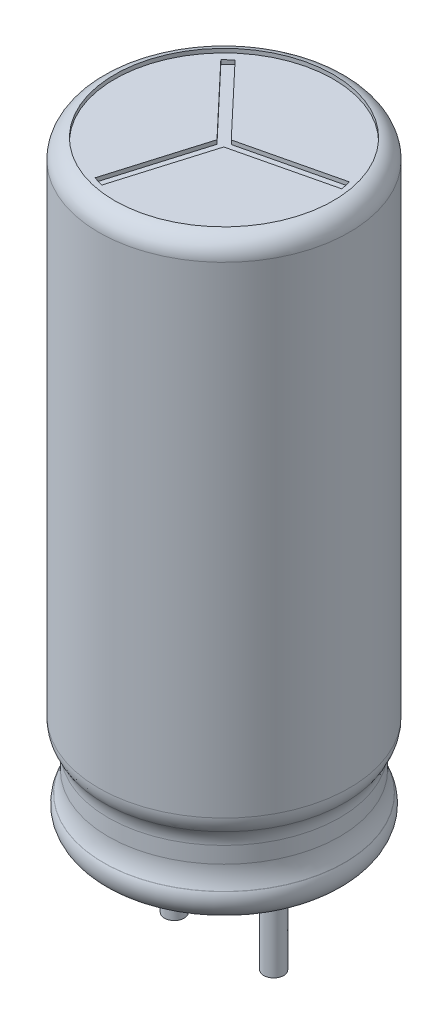
ISO-10303-21;
HEADER;
FILE_DESCRIPTION(('STEP AP214'),'2;1');
FILE_NAME('part.step','',(''),(''),'','','');
FILE_SCHEMA(('AUTOMOTIVE_DESIGN { 1 0 10303 214 1 1 1 1 }'));
ENDSEC;
DATA;
#1=APPLICATION_CONTEXT('core data for automotive mechanical design processes');
#2=APPLICATION_PROTOCOL_DEFINITION('international standard','automotive_design',2000,#1);
#3=PRODUCT_CONTEXT('',#1,'mechanical');
#4=PRODUCT('Part','Part','',(#3));
#5=PRODUCT_RELATED_PRODUCT_CATEGORY('part','',(#4));
#6=PRODUCT_DEFINITION_FORMATION('','',#4);
#7=PRODUCT_DEFINITION_CONTEXT('part definition',#1,'design');
#8=PRODUCT_DEFINITION('design','',#6,#7);
#9=PRODUCT_DEFINITION_SHAPE('','',#8);
#10=(LENGTH_UNIT() NAMED_UNIT(*) SI_UNIT(.MILLI.,.METRE.));
#11=(NAMED_UNIT(*) PLANE_ANGLE_UNIT() SI_UNIT($,.RADIAN.));
#12=(NAMED_UNIT(*) SI_UNIT($,.STERADIAN.) SOLID_ANGLE_UNIT());
#13=UNCERTAINTY_MEASURE_WITH_UNIT(LENGTH_MEASURE(1.E-05),#10,'distance_accuracy_value','');
#14=(GEOMETRIC_REPRESENTATION_CONTEXT(3) GLOBAL_UNCERTAINTY_ASSIGNED_CONTEXT((#13)) GLOBAL_UNIT_ASSIGNED_CONTEXT((#10,
#11,#12)) REPRESENTATION_CONTEXT('',''));
#15=CARTESIAN_POINT('',(0.,0.,0.));
#16=DIRECTION('',(0.,0.,1.));
#17=DIRECTION('',(1.,0.,0.));
#18=AXIS2_PLACEMENT_3D('',#15,#16,#17);
#19=CARTESIAN_POINT('',(0.,15.,0.));
#20=DIRECTION('',(0.,-1.,0.));
#21=DIRECTION('',(0.,0.,-1.));
#22=AXIS2_PLACEMENT_3D('',#19,#20,#21);
#23=CYLINDRICAL_SURFACE('',#22,3.15);
#24=CARTESIAN_POINT('',(0.,14.5101020514434,0.));
#25=DIRECTION('',(0.,1.,0.));
#26=DIRECTION('',(0.,0.,1.));
#27=AXIS2_PLACEMENT_3D('',#24,#25,#26);
#28=CIRCLE('',#27,3.15);
#29=CARTESIAN_POINT('',(0.,14.5101020514434,3.15));
#30=VERTEX_POINT('',#29);
#31=EDGE_CURVE('E231',#30,#30,#28,.F.);
#32=ORIENTED_EDGE('',*,*,#31,.T.);
#33=EDGE_LOOP('',(#32));
#34=FACE_BOUND('',#33,.T.);
#35=CARTESIAN_POINT('',(0.,2.40756880196224,0.));
#36=DIRECTION('',(0.,-1.,0.));
#37=DIRECTION('',(0.,0.,-1.));
#38=AXIS2_PLACEMENT_3D('',#35,#36,#37);
#39=CIRCLE('',#38,3.15);
#40=CARTESIAN_POINT('',(0.,2.40756880196224,-3.15));
#41=VERTEX_POINT('',#40);
#42=EDGE_CURVE('E208',#41,#41,#39,.T.);
#43=ORIENTED_EDGE('',*,*,#42,.F.);
#44=EDGE_LOOP('',(#43));
#45=FACE_BOUND('',#44,.T.);
#46=ADVANCED_FACE('F38',(#34,#45),#23,.T.);
#47=CARTESIAN_POINT('',(0.,0.,0.));
#48=DIRECTION('',(0.,-1.,0.));
#49=DIRECTION('',(0.,0.,-1.));
#50=AXIS2_PLACEMENT_3D('',#47,#48,#49);
#51=PLANE('',#50);
#52=CARTESIAN_POINT('',(-1.25,0.,0.));
#53=DIRECTION('',(0.,-1.,0.));
#54=DIRECTION('',(0.,0.,-1.));
#55=AXIS2_PLACEMENT_3D('',#52,#53,#54);
#56=CIRCLE('',#55,0.25);
#57=CARTESIAN_POINT('',(-1.25,0.,-0.25));
#58=VERTEX_POINT('',#57);
#59=EDGE_CURVE('E11',#58,#58,#56,.T.);
#60=ORIENTED_EDGE('',*,*,#59,.F.);
#61=EDGE_LOOP('',(#60));
#62=FACE_BOUND('',#61,.T.);
#63=CARTESIAN_POINT('',(1.25,0.,0.));
#64=DIRECTION('',(0.,-1.,0.));
#65=DIRECTION('',(0.,0.,-1.));
#66=AXIS2_PLACEMENT_3D('',#63,#64,#65);
#67=CIRCLE('',#66,0.25);
#68=CARTESIAN_POINT('',(1.25,0.,-0.25));
#69=VERTEX_POINT('',#68);
#70=EDGE_CURVE('E47',#69,#69,#67,.T.);
#71=ORIENTED_EDGE('',*,*,#70,.F.);
#72=EDGE_LOOP('',(#71));
#73=FACE_BOUND('',#72,.T.);
#74=CARTESIAN_POINT('',(0.,0.,0.));
#75=DIRECTION('',(0.,-1.,0.));
#76=DIRECTION('',(0.,0.,-1.));
#77=AXIS2_PLACEMENT_3D('',#74,#75,#76);
#78=CIRCLE('',#77,2.583882438621);
#79=CARTESIAN_POINT('',(0.,0.,-2.583882438621));
#80=VERTEX_POINT('',#79);
#81=EDGE_CURVE('E235',#80,#80,#78,.T.);
#82=ORIENTED_EDGE('',*,*,#81,.T.);
#83=EDGE_LOOP('',(#82));
#84=FACE_BOUND('',#83,.T.);
#85=ADVANCED_FACE('F248',(#62,#73,#84),#51,.T.);
#86=CARTESIAN_POINT('',(0.,0.362697062752752,0.));
#87=DIRECTION('',(0.,-1.,0.));
#88=DIRECTION('',(0.,0.,-1.));
#89=AXIS2_PLACEMENT_3D('',#86,#87,#88);
#90=TOROIDAL_SURFACE('',#89,2.30519901542106,0.810671123445938);
#91=CARTESIAN_POINT('',(0.,0.720977952061164,0.));
#92=DIRECTION('',(0.,-1.,0.));
#93=DIRECTION('',(0.,0.,-1.));
#94=AXIS2_PLACEMENT_3D('',#91,#92,#93);
#95=CIRCLE('',#94,3.03240082698747);
#96=CARTESIAN_POINT('',(0.,0.720977952061164,-3.03240082698747));
#97=VERTEX_POINT('',#96);
#98=EDGE_CURVE('E239',#97,#97,#95,.F.);
#99=ORIENTED_EDGE('',*,*,#98,.T.);
#100=EDGE_LOOP('',(#99));
#101=FACE_BOUND('',#100,.T.);
#102=CARTESIAN_POINT('',(0.,0.725394125505504,0.));
#103=DIRECTION('',(0.,-1.,0.));
#104=DIRECTION('',(0.,0.,-1.));
#105=AXIS2_PLACEMENT_3D('',#102,#103,#104);
#106=CIRCLE('',#105,3.03020833333333);
#107=CARTESIAN_POINT('',(0.,0.725394125505504,-3.03020833333333));
#108=VERTEX_POINT('',#107);
#109=EDGE_CURVE('E227',#108,#108,#106,.T.);
#110=ORIENTED_EDGE('',*,*,#109,.T.);
#111=EDGE_LOOP('',(#110));
#112=FACE_BOUND('',#111,.T.);
#113=ADVANCED_FACE('F251',(#101,#112),#90,.T.);
#114=CARTESIAN_POINT('',(0.,1.23259900370742,0.));
#115=DIRECTION('',(0.,-1.,0.));
#116=DIRECTION('',(0.,0.,-1.));
#117=AXIS2_PLACEMENT_3D('',#114,#115,#116);
#118=TOROIDAL_SURFACE('',#117,4.04407996492587,1.1336632982592);
#119=CARTESIAN_POINT('',(0.,1.23259900370742,0.));
#120=DIRECTION('',(0.,-1.,0.));
#121=DIRECTION('',(0.,0.,-1.));
#122=AXIS2_PLACEMENT_3D('',#119,#120,#121);
#123=CIRCLE('',#122,2.91041666666667);
#124=CARTESIAN_POINT('',(0.,1.23259900370742,-2.91041666666667));
#125=VERTEX_POINT('',#124);
#126=EDGE_CURVE('E223',#125,#125,#123,.T.);
#127=ORIENTED_EDGE('',*,*,#126,.T.);
#128=EDGE_LOOP('',(#127));
#129=FACE_BOUND('',#128,.T.);
#130=ORIENTED_EDGE('',*,*,#109,.F.);
#131=EDGE_LOOP('',(#130));
#132=FACE_BOUND('',#131,.T.);
#133=ADVANCED_FACE('F277',(#129,#132),#118,.F.);
#134=CARTESIAN_POINT('',(0.,15.,0.));
#135=DIRECTION('',(0.,-1.,0.));
#136=DIRECTION('',(0.,0.,-1.));
#137=AXIS2_PLACEMENT_3D('',#134,#135,#136);
#138=CYLINDRICAL_SURFACE('',#137,2.91041666666667);
#139=CARTESIAN_POINT('',(0.,1.64240099629258,0.));
#140=DIRECTION('',(0.,-1.,0.));
#141=DIRECTION('',(0.,0.,-1.));
#142=AXIS2_PLACEMENT_3D('',#139,#140,#141);
#143=CIRCLE('',#142,2.91041666666667);
#144=CARTESIAN_POINT('',(0.,1.64240099629258,-2.91041666666667));
#145=VERTEX_POINT('',#144);
#146=EDGE_CURVE('E219',#145,#145,#143,.T.);
#147=ORIENTED_EDGE('',*,*,#146,.T.);
#148=EDGE_LOOP('',(#147));
#149=FACE_BOUND('',#148,.T.);
#150=ORIENTED_EDGE('',*,*,#126,.F.);
#151=EDGE_LOOP('',(#150));
#152=FACE_BOUND('',#151,.T.);
#153=ADVANCED_FACE('F281',(#149,#152),#138,.T.);
#154=CARTESIAN_POINT('',(0.,1.64240099629258,0.));
#155=DIRECTION('',(0.,-1.,0.));
#156=DIRECTION('',(0.,0.,-1.));
#157=AXIS2_PLACEMENT_3D('',#154,#155,#156);
#158=TOROIDAL_SURFACE('',#157,3.58125,0.670833333333335);
#159=CARTESIAN_POINT('',(0.,2.02498489912741,0.));
#160=DIRECTION('',(0.,-1.,0.));
#161=DIRECTION('',(0.,0.,-1.));
#162=AXIS2_PLACEMENT_3D('',#159,#160,#161);
#163=CIRCLE('',#162,3.03020833333333);
#164=CARTESIAN_POINT('',(0.,2.02498489912741,-3.03020833333333));
#165=VERTEX_POINT('',#164);
#166=EDGE_CURVE('E215',#165,#165,#163,.T.);
#167=ORIENTED_EDGE('',*,*,#166,.T.);
#168=EDGE_LOOP('',(#167));
#169=FACE_BOUND('',#168,.T.);
#170=ORIENTED_EDGE('',*,*,#146,.F.);
#171=EDGE_LOOP('',(#170));
#172=FACE_BOUND('',#171,.T.);
#173=ADVANCED_FACE('F285',(#169,#172),#158,.F.);
#174=CARTESIAN_POINT('',(0.,2.40756880196224,0.));
#175=DIRECTION('',(0.,-1.,0.));
#176=DIRECTION('',(0.,0.,-1.));
#177=AXIS2_PLACEMENT_3D('',#174,#175,#176);
#178=TOROIDAL_SURFACE('',#177,2.47916666666667,0.670833333333332);
#179=ORIENTED_EDGE('',*,*,#42,.T.);
#180=EDGE_LOOP('',(#179));
#181=FACE_BOUND('',#180,.T.);
#182=ORIENTED_EDGE('',*,*,#166,.F.);
#183=EDGE_LOOP('',(#182));
#184=FACE_BOUND('',#183,.T.);
#185=ADVANCED_FACE('F289',(#181,#184),#178,.T.);
#186=CARTESIAN_POINT('',(0.,14.9,0.));
#187=DIRECTION('',(0.,1.,0.));
#188=DIRECTION('',(0.,0.,1.));
#189=AXIS2_PLACEMENT_3D('',#186,#187,#188);
#190=CYLINDRICAL_SURFACE('',#189,2.75);
#191=CARTESIAN_POINT('',(0.,14.9,0.));
#192=DIRECTION('',(0.,1.,0.));
#193=DIRECTION('',(0.,0.,-1.));
#194=AXIS2_PLACEMENT_3D('',#191,#192,#193);
#195=CIRCLE('',#194,2.75);
#196=CARTESIAN_POINT('',(0.,14.9,-2.75));
#197=VERTEX_POINT('',#196);
#198=EDGE_CURVE('E204',#197,#197,#195,.T.);
#199=ORIENTED_EDGE('',*,*,#198,.F.);
#200=EDGE_LOOP('',(#199));
#201=FACE_BOUND('',#200,.T.);
#202=CARTESIAN_POINT('',(0.,15.,0.));
#203=DIRECTION('',(0.,1.,0.));
#204=DIRECTION('',(0.,0.,-1.));
#205=AXIS2_PLACEMENT_3D('',#202,#203,#204);
#206=CIRCLE('',#205,2.75);
#207=CARTESIAN_POINT('',(0.,15.,-2.75));
#208=VERTEX_POINT('',#207);
#209=EDGE_CURVE('E185',#208,#208,#206,.T.);
#210=ORIENTED_EDGE('',*,*,#209,.T.);
#211=EDGE_LOOP('',(#210));
#212=FACE_BOUND('',#211,.T.);
#213=ADVANCED_FACE('F293',(#201,#212),#190,.F.);
#214=CARTESIAN_POINT('',(0.,14.9,0.));
#215=DIRECTION('',(0.,-1.,0.));
#216=DIRECTION('',(0.,0.,-1.));
#217=AXIS2_PLACEMENT_3D('',#214,#215,#216);
#218=PLANE('',#217);
#219=DIRECTION('',(-0.72638071356326,0.,0.687292557040545));
#220=VECTOR('',#219,1.);
#221=CARTESIAN_POINT('',(-1.65347274426045,14.9,-1.93229316719483));
#222=LINE('',#221,#220);
#223=CARTESIAN_POINT('',(-1.65347274426045,14.9,-1.93229316719483));
#224=VERTEX_POINT('',#223);
#225=CARTESIAN_POINT('',(-1.83797344550552,14.9,-1.75772085770653));
#226=VERTEX_POINT('',#225);
#227=EDGE_CURVE('E154',#224,#226,#222,.T.);
#228=ORIENTED_EDGE('',*,*,#227,.F.);
#229=DIRECTION('',(-0.687292557040545,0.,-0.726380713563259));
#230=VECTOR('',#229,1.);
#231=CARTESIAN_POINT('',(0.0418556656844723,14.9,-0.140546919508906));
#232=LINE('',#231,#230);
#233=CARTESIAN_POINT('',(0.0418556656844723,14.9,-0.140546919508906));
#234=VERTEX_POINT('',#233);
#235=EDGE_CURVE('E54',#234,#224,#232,.T.);
#236=ORIENTED_EDGE('',*,*,#235,.F.);
#237=DIRECTION('',(-0.972710429285124,0.,0.232022457447443));
#238=VECTOR('',#237,1.);
#239=CARTESIAN_POINT('',(2.44121763828839,14.9,-0.712871266435717));
#240=LINE('',#239,#238);
#241=CARTESIAN_POINT('',(2.44121763828839,14.9,-0.712871266435717));
#242=VERTEX_POINT('',#241);
#243=EDGE_CURVE('E179',#242,#234,#240,.T.);
#244=ORIENTED_EDGE('',*,*,#243,.F.);
#245=DIRECTION('',(-0.232022457447444,0.,-0.972710429285123));
#246=VECTOR('',#245,1.);
#247=CARTESIAN_POINT('',(2.50015134248004,14.9,-0.465802817397295));
#248=LINE('',#247,#246);
#249=CARTESIAN_POINT('',(2.50015134248004,14.9,-0.465802817397295));
#250=VERTEX_POINT('',#249);
#251=EDGE_CURVE('E176',#250,#242,#248,.T.);
#252=ORIENTED_EDGE('',*,*,#251,.F.);
#253=DIRECTION('',(0.972710429285124,0.,-0.232022457447443));
#254=VECTOR('',#253,1.);
#255=CARTESIAN_POINT('',(0.100789369876124,14.9,0.106521529529515));
#256=LINE('',#255,#254);
#257=CARTESIAN_POINT('',(0.100789369876124,14.9,0.106521529529515));
#258=VERTEX_POINT('',#257);
#259=EDGE_CURVE('E120',#258,#250,#256,.T.);
#260=ORIENTED_EDGE('',*,*,#259,.F.);
#261=DIRECTION('',(0.285417872244573,0.,-0.958403171010708));
#262=VECTOR('',#261,1.);
#263=CARTESIAN_POINT('',(-0.603244192782856,14.9,2.47059212414226));
#264=LINE('',#263,#262);
#265=CARTESIAN_POINT('',(-0.603244192782856,14.9,2.47059212414226));
#266=VERTEX_POINT('',#265);
#267=EDGE_CURVE('E170',#266,#258,#264,.T.);
#268=ORIENTED_EDGE('',*,*,#267,.F.);
#269=DIRECTION('',(0.958403171010708,0.,0.285417872244573));
#270=VECTOR('',#269,1.);
#271=CARTESIAN_POINT('',(-0.846678598219576,14.9,2.39809598459214));
#272=LINE('',#271,#270);
#273=CARTESIAN_POINT('',(-0.846678598219576,14.9,2.39809598459214));
#274=VERTEX_POINT('',#273);
#275=EDGE_CURVE('E166',#274,#266,#272,.T.);
#276=ORIENTED_EDGE('',*,*,#275,.F.);
#277=DIRECTION('',(-0.285417872244573,0.,0.958403171010708));
#278=VECTOR('',#277,1.);
#279=CARTESIAN_POINT('',(-0.142645035560596,14.9,0.0340253899793922));
#280=LINE('',#279,#278);
#281=CARTESIAN_POINT('',(-0.142645035560596,14.9,0.0340253899793922));
#282=VERTEX_POINT('',#281);
#283=EDGE_CURVE('E162',#282,#274,#280,.T.);
#284=ORIENTED_EDGE('',*,*,#283,.F.);
#285=DIRECTION('',(0.687292557040545,0.,0.726380713563259));
#286=VECTOR('',#285,1.);
#287=CARTESIAN_POINT('',(-1.83797344550552,14.9,-1.75772085770653));
#288=LINE('',#287,#286);
#289=EDGE_CURVE('E158',#226,#282,#288,.T.);
#290=ORIENTED_EDGE('',*,*,#289,.F.);
#291=EDGE_LOOP('',(#228,#236,#244,#252,#260,#268,#276,#284,#290));
#292=FACE_BOUND('',#291,.T.);
#293=ORIENTED_EDGE('',*,*,#198,.T.);
#294=EDGE_LOOP('',(#293));
#295=FACE_BOUND('',#294,.T.);
#296=ADVANCED_FACE('F297',(#292,#295),#218,.F.);
#297=CARTESIAN_POINT('',(0.0418556656844723,14.8,-0.140546919508906));
#298=DIRECTION('',(0.726380713563259,0.,-0.687292557040545));
#299=DIRECTION('',(-0.687292557040545,0.,-0.726380713563259));
#300=AXIS2_PLACEMENT_3D('',#297,#298,#299);
#301=PLANE('',#300);
#302=ORIENTED_EDGE('',*,*,#235,.T.);
#303=DIRECTION('',(0.,1.,0.));
#304=VECTOR('',#303,1.);
#305=CARTESIAN_POINT('',(-1.65347274426045,14.8,-1.93229316719483));
#306=LINE('',#305,#304);
#307=CARTESIAN_POINT('',(-1.65347274426045,14.8,-1.93229316719483));
#308=VERTEX_POINT('',#307);
#309=EDGE_CURVE('E93',#308,#224,#306,.T.);
#310=ORIENTED_EDGE('',*,*,#309,.F.);
#311=DIRECTION('',(-0.687292557040545,0.,-0.726380713563259));
#312=VECTOR('',#311,1.);
#313=CARTESIAN_POINT('',(0.0418556656844723,14.8,-0.140546919508906));
#314=LINE('',#313,#312);
#315=CARTESIAN_POINT('',(0.0418556656844723,14.8,-0.140546919508906));
#316=VERTEX_POINT('',#315);
#317=EDGE_CURVE('E182',#316,#308,#314,.T.);
#318=ORIENTED_EDGE('',*,*,#317,.F.);
#319=DIRECTION('',(0.,1.,0.));
#320=VECTOR('',#319,1.);
#321=CARTESIAN_POINT('',(0.0418556656844723,14.8,-0.140546919508906));
#322=LINE('',#321,#320);
#323=EDGE_CURVE('E62',#316,#234,#322,.T.);
#324=ORIENTED_EDGE('',*,*,#323,.T.);
#325=EDGE_LOOP('',(#302,#310,#318,#324));
#326=FACE_BOUND('',#325,.T.);
#327=ADVANCED_FACE('F301',(#326),#301,.F.);
#328=CARTESIAN_POINT('',(2.44121763828839,14.8,-0.712871266435717));
#329=DIRECTION('',(-0.232022457447443,0.,-0.972710429285124));
#330=DIRECTION('',(-0.972710429285124,0.,0.232022457447443));
#331=AXIS2_PLACEMENT_3D('',#328,#329,#330);
#332=PLANE('',#331);
#333=ORIENTED_EDGE('',*,*,#243,.T.);
#334=ORIENTED_EDGE('',*,*,#323,.F.);
#335=DIRECTION('',(-0.972710429285124,0.,0.232022457447443));
#336=VECTOR('',#335,1.);
#337=CARTESIAN_POINT('',(2.44121763828839,14.8,-0.712871266435717));
#338=LINE('',#337,#336);
#339=CARTESIAN_POINT('',(2.44121763828839,14.8,-0.712871266435717));
#340=VERTEX_POINT('',#339);
#341=EDGE_CURVE('E134',#340,#316,#338,.T.);
#342=ORIENTED_EDGE('',*,*,#341,.F.);
#343=DIRECTION('',(0.,1.,0.));
#344=VECTOR('',#343,1.);
#345=CARTESIAN_POINT('',(2.44121763828839,14.8,-0.712871266435717));
#346=LINE('',#345,#344);
#347=EDGE_CURVE('E125',#340,#242,#346,.T.);
#348=ORIENTED_EDGE('',*,*,#347,.T.);
#349=EDGE_LOOP('',(#333,#334,#342,#348));
#350=FACE_BOUND('',#349,.T.);
#351=ADVANCED_FACE('F305',(#350),#332,.F.);
#352=CARTESIAN_POINT('',(2.50015134248004,14.8,-0.465802817397295));
#353=DIRECTION('',(0.972710429285123,0.,-0.232022457447444));
#354=DIRECTION('',(-0.232022457447444,0.,-0.972710429285123));
#355=AXIS2_PLACEMENT_3D('',#352,#353,#354);
#356=PLANE('',#355);
#357=ORIENTED_EDGE('',*,*,#251,.T.);
#358=ORIENTED_EDGE('',*,*,#347,.F.);
#359=DIRECTION('',(-0.232022457447444,0.,-0.972710429285123));
#360=VECTOR('',#359,1.);
#361=CARTESIAN_POINT('',(2.50015134248004,14.8,-0.465802817397295));
#362=LINE('',#361,#360);
#363=CARTESIAN_POINT('',(2.50015134248004,14.8,-0.465802817397295));
#364=VERTEX_POINT('',#363);
#365=EDGE_CURVE('E129',#364,#340,#362,.T.);
#366=ORIENTED_EDGE('',*,*,#365,.F.);
#367=DIRECTION('',(0.,1.,0.));
#368=VECTOR('',#367,1.);
#369=CARTESIAN_POINT('',(2.50015134248004,14.8,-0.465802817397295));
#370=LINE('',#369,#368);
#371=EDGE_CURVE('E113',#364,#250,#370,.T.);
#372=ORIENTED_EDGE('',*,*,#371,.T.);
#373=EDGE_LOOP('',(#357,#358,#366,#372));
#374=FACE_BOUND('',#373,.T.);
#375=ADVANCED_FACE('F130',(#374),#356,.F.);
#376=CARTESIAN_POINT('',(0.100789369876124,14.8,0.106521529529515));
#377=DIRECTION('',(0.232022457447443,0.,0.972710429285124));
#378=DIRECTION('',(0.972710429285124,0.,-0.232022457447443));
#379=AXIS2_PLACEMENT_3D('',#376,#377,#378);
#380=PLANE('',#379);
#381=ORIENTED_EDGE('',*,*,#259,.T.);
#382=ORIENTED_EDGE('',*,*,#371,.F.);
#383=DIRECTION('',(0.972710429285124,0.,-0.232022457447443));
#384=VECTOR('',#383,1.);
#385=CARTESIAN_POINT('',(0.100789369876124,14.8,0.106521529529515));
#386=LINE('',#385,#384);
#387=CARTESIAN_POINT('',(0.100789369876124,14.8,0.106521529529515));
#388=VERTEX_POINT('',#387);
#389=EDGE_CURVE('E117',#388,#364,#386,.T.);
#390=ORIENTED_EDGE('',*,*,#389,.F.);
#391=DIRECTION('',(0.,1.,0.));
#392=VECTOR('',#391,1.);
#393=CARTESIAN_POINT('',(0.100789369876124,14.8,0.106521529529515));
#394=LINE('',#393,#392);
#395=EDGE_CURVE('E126',#388,#258,#394,.T.);
#396=ORIENTED_EDGE('',*,*,#395,.T.);
#397=EDGE_LOOP('',(#381,#382,#390,#396));
#398=FACE_BOUND('',#397,.T.);
#399=ADVANCED_FACE('F115',(#398),#380,.F.);
#400=CARTESIAN_POINT('',(-0.603244192782856,14.8,2.47059212414226));
#401=DIRECTION('',(0.958403171010708,0.,0.285417872244573));
#402=DIRECTION('',(0.285417872244573,0.,-0.958403171010708));
#403=AXIS2_PLACEMENT_3D('',#400,#401,#402);
#404=PLANE('',#403);
#405=ORIENTED_EDGE('',*,*,#267,.T.);
#406=ORIENTED_EDGE('',*,*,#395,.F.);
#407=DIRECTION('',(0.285417872244573,0.,-0.958403171010708));
#408=VECTOR('',#407,1.);
#409=CARTESIAN_POINT('',(-0.603244192782856,14.8,2.47059212414226));
#410=LINE('',#409,#408);
#411=CARTESIAN_POINT('',(-0.603244192782856,14.8,2.47059212414226));
#412=VERTEX_POINT('',#411);
#413=EDGE_CURVE('E140',#412,#388,#410,.T.);
#414=ORIENTED_EDGE('',*,*,#413,.F.);
#415=DIRECTION('',(0.,1.,0.));
#416=VECTOR('',#415,1.);
#417=CARTESIAN_POINT('',(-0.603244192782856,14.8,2.47059212414226));
#418=LINE('',#417,#416);
#419=EDGE_CURVE('E190',#412,#266,#418,.T.);
#420=ORIENTED_EDGE('',*,*,#419,.T.);
#421=EDGE_LOOP('',(#405,#406,#414,#420));
#422=FACE_BOUND('',#421,.T.);
#423=ADVANCED_FACE('F321',(#422),#404,.F.);
#424=CARTESIAN_POINT('',(-0.846678598219576,14.8,2.39809598459214));
#425=DIRECTION('',(-0.285417872244573,0.,0.958403171010708));
#426=DIRECTION('',(0.958403171010708,0.,0.285417872244573));
#427=AXIS2_PLACEMENT_3D('',#424,#425,#426);
#428=PLANE('',#427);
#429=ORIENTED_EDGE('',*,*,#275,.T.);
#430=ORIENTED_EDGE('',*,*,#419,.F.);
#431=DIRECTION('',(0.958403171010708,0.,0.285417872244573));
#432=VECTOR('',#431,1.);
#433=CARTESIAN_POINT('',(-0.846678598219576,14.8,2.39809598459214));
#434=LINE('',#433,#432);
#435=CARTESIAN_POINT('',(-0.846678598219576,14.8,2.39809598459214));
#436=VERTEX_POINT('',#435);
#437=EDGE_CURVE('E146',#436,#412,#434,.T.);
#438=ORIENTED_EDGE('',*,*,#437,.F.);
#439=DIRECTION('',(0.,1.,0.));
#440=VECTOR('',#439,1.);
#441=CARTESIAN_POINT('',(-0.846678598219576,14.8,2.39809598459214));
#442=LINE('',#441,#440);
#443=EDGE_CURVE('E193',#436,#274,#442,.T.);
#444=ORIENTED_EDGE('',*,*,#443,.T.);
#445=EDGE_LOOP('',(#429,#430,#438,#444));
#446=FACE_BOUND('',#445,.T.);
#447=ADVANCED_FACE('F317',(#446),#428,.F.);
#448=CARTESIAN_POINT('',(-0.142645035560596,14.8,0.0340253899793922));
#449=DIRECTION('',(-0.958403171010708,0.,-0.285417872244573));
#450=DIRECTION('',(-0.285417872244573,0.,0.958403171010708));
#451=AXIS2_PLACEMENT_3D('',#448,#449,#450);
#452=PLANE('',#451);
#453=ORIENTED_EDGE('',*,*,#283,.T.);
#454=ORIENTED_EDGE('',*,*,#443,.F.);
#455=DIRECTION('',(-0.285417872244573,0.,0.958403171010708));
#456=VECTOR('',#455,1.);
#457=CARTESIAN_POINT('',(-0.142645035560596,14.8,0.0340253899793922));
#458=LINE('',#457,#456);
#459=CARTESIAN_POINT('',(-0.142645035560596,14.8,0.0340253899793922));
#460=VERTEX_POINT('',#459);
#461=EDGE_CURVE('E364',#460,#436,#458,.T.);
#462=ORIENTED_EDGE('',*,*,#461,.F.);
#463=DIRECTION('',(0.,1.,0.));
#464=VECTOR('',#463,1.);
#465=CARTESIAN_POINT('',(-0.142645035560596,14.8,0.0340253899793922));
#466=LINE('',#465,#464);
#467=EDGE_CURVE('E196',#460,#282,#466,.T.);
#468=ORIENTED_EDGE('',*,*,#467,.T.);
#469=EDGE_LOOP('',(#453,#454,#462,#468));
#470=FACE_BOUND('',#469,.T.);
#471=ADVANCED_FACE('F313',(#470),#452,.F.);
#472=CARTESIAN_POINT('',(-1.83797344550552,14.8,-1.75772085770653));
#473=DIRECTION('',(-0.726380713563259,0.,0.687292557040545));
#474=DIRECTION('',(0.687292557040545,0.,0.726380713563259));
#475=AXIS2_PLACEMENT_3D('',#472,#473,#474);
#476=PLANE('',#475);
#477=ORIENTED_EDGE('',*,*,#289,.T.);
#478=ORIENTED_EDGE('',*,*,#467,.F.);
#479=DIRECTION('',(0.687292557040545,0.,0.726380713563259));
#480=VECTOR('',#479,1.);
#481=CARTESIAN_POINT('',(-1.83797344550552,14.8,-1.75772085770653));
#482=LINE('',#481,#480);
#483=CARTESIAN_POINT('',(-1.83797344550552,14.8,-1.75772085770653));
#484=VERTEX_POINT('',#483);
#485=EDGE_CURVE('E360',#484,#460,#482,.T.);
#486=ORIENTED_EDGE('',*,*,#485,.F.);
#487=DIRECTION('',(0.,1.,0.));
#488=VECTOR('',#487,1.);
#489=CARTESIAN_POINT('',(-1.83797344550552,14.8,-1.75772085770653));
#490=LINE('',#489,#488);
#491=EDGE_CURVE('E199',#484,#226,#490,.T.);
#492=ORIENTED_EDGE('',*,*,#491,.T.);
#493=EDGE_LOOP('',(#477,#478,#486,#492));
#494=FACE_BOUND('',#493,.T.);
#495=ADVANCED_FACE('F309',(#494),#476,.F.);
#496=CARTESIAN_POINT('',(-1.65347274426045,14.8,-1.93229316719483));
#497=DIRECTION('',(-0.687292557040544,0.,-0.72638071356326));
#498=DIRECTION('',(-0.72638071356326,0.,0.687292557040544));
#499=AXIS2_PLACEMENT_3D('',#496,#497,#498);
#500=PLANE('',#499);
#501=ORIENTED_EDGE('',*,*,#227,.T.);
#502=ORIENTED_EDGE('',*,*,#491,.F.);
#503=DIRECTION('',(-0.72638071356326,0.,0.687292557040545));
#504=VECTOR('',#503,1.);
#505=CARTESIAN_POINT('',(-1.65347274426045,14.8,-1.93229316719483));
#506=LINE('',#505,#504);
#507=EDGE_CURVE('E356',#308,#484,#506,.T.);
#508=ORIENTED_EDGE('',*,*,#507,.F.);
#509=ORIENTED_EDGE('',*,*,#309,.T.);
#510=EDGE_LOOP('',(#501,#502,#508,#509));
#511=FACE_BOUND('',#510,.T.);
#512=ADVANCED_FACE('F306',(#511),#500,.F.);
#513=CARTESIAN_POINT('',(0.,14.8,0.));
#514=DIRECTION('',(0.,1.,0.));
#515=DIRECTION('',(0.,0.,1.));
#516=AXIS2_PLACEMENT_3D('',#513,#514,#515);
#517=PLANE('',#516);
#518=ORIENTED_EDGE('',*,*,#317,.T.);
#519=ORIENTED_EDGE('',*,*,#507,.T.);
#520=ORIENTED_EDGE('',*,*,#485,.T.);
#521=ORIENTED_EDGE('',*,*,#461,.T.);
#522=ORIENTED_EDGE('',*,*,#437,.T.);
#523=ORIENTED_EDGE('',*,*,#413,.T.);
#524=ORIENTED_EDGE('',*,*,#389,.T.);
#525=ORIENTED_EDGE('',*,*,#365,.T.);
#526=ORIENTED_EDGE('',*,*,#341,.T.);
#527=EDGE_LOOP('',(#518,#519,#520,#521,#522,#523,#524,#525,#526));
#528=FACE_BOUND('',#527,.T.);
#529=ADVANCED_FACE('F137',(#528),#517,.T.);
#530=CARTESIAN_POINT('',(0.,14.5101020514434,0.));
#531=DIRECTION('',(0.,1.,0.));
#532=DIRECTION('',(0.,0.,1.));
#533=AXIS2_PLACEMENT_3D('',#530,#531,#532);
#534=TOROIDAL_SURFACE('',#533,2.65,0.5);
#535=ORIENTED_EDGE('',*,*,#209,.F.);
#536=EDGE_LOOP('',(#535));
#537=FACE_BOUND('',#536,.T.);
#538=ORIENTED_EDGE('',*,*,#31,.F.);
#539=EDGE_LOOP('',(#538));
#540=FACE_BOUND('',#539,.T.);
#541=ADVANCED_FACE('F257',(#537,#540),#534,.T.);
#542=CARTESIAN_POINT('',(0.,0.5,0.));
#543=DIRECTION('',(0.,-1.,0.));
#544=DIRECTION('',(0.,0.,-1.));
#545=AXIS2_PLACEMENT_3D('',#542,#543,#544);
#546=TOROIDAL_SURFACE('',#545,2.583882438621,0.5);
#547=ORIENTED_EDGE('',*,*,#98,.F.);
#548=EDGE_LOOP('',(#547));
#549=FACE_BOUND('',#548,.T.);
#550=ORIENTED_EDGE('',*,*,#81,.F.);
#551=EDGE_LOOP('',(#550));
#552=FACE_BOUND('',#551,.T.);
#553=ADVANCED_FACE('F40',(#549,#552),#546,.T.);
#554=CARTESIAN_POINT('',(1.25,-2.5,0.));
#555=DIRECTION('',(0.,1.,0.));
#556=DIRECTION('',(-1.,0.,0.));
#557=AXIS2_PLACEMENT_3D('',#554,#555,#556);
#558=CYLINDRICAL_SURFACE('',#557,0.25);
#559=CARTESIAN_POINT('',(1.25,-2.5,0.));
#560=DIRECTION('',(0.,1.,0.));
#561=DIRECTION('',(-1.,0.,0.));
#562=AXIS2_PLACEMENT_3D('',#559,#560,#561);
#563=CIRCLE('',#562,0.25);
#564=CARTESIAN_POINT('',(1.,-2.5,0.));
#565=VERTEX_POINT('',#564);
#566=EDGE_CURVE('E155',#565,#565,#563,.T.);
#567=ORIENTED_EDGE('',*,*,#566,.T.);
#568=EDGE_LOOP('',(#567));
#569=FACE_BOUND('',#568,.T.);
#570=ORIENTED_EDGE('',*,*,#70,.T.);
#571=EDGE_LOOP('',(#570));
#572=FACE_BOUND('',#571,.T.);
#573=ADVANCED_FACE('F246',(#569,#572),#558,.T.);
#574=CARTESIAN_POINT('',(1.5,-2.5,0.));
#575=DIRECTION('',(0.,-1.,0.));
#576=DIRECTION('',(1.,0.,0.));
#577=AXIS2_PLACEMENT_3D('',#574,#575,#576);
#578=PLANE('',#577);
#579=ORIENTED_EDGE('',*,*,#566,.F.);
#580=EDGE_LOOP('',(#579));
#581=FACE_BOUND('',#580,.T.);
#582=ADVANCED_FACE('F263',(#581),#578,.T.);
#583=CARTESIAN_POINT('',(-1.25,-2.5,0.));
#584=DIRECTION('',(0.,1.,0.));
#585=DIRECTION('',(1.,0.,0.));
#586=AXIS2_PLACEMENT_3D('',#583,#584,#585);
#587=CYLINDRICAL_SURFACE('',#586,0.25);
#588=CARTESIAN_POINT('',(-1.25,-2.5,0.));
#589=DIRECTION('',(0.,-1.,0.));
#590=DIRECTION('',(1.,0.,0.));
#591=AXIS2_PLACEMENT_3D('',#588,#589,#590);
#592=CIRCLE('',#591,0.25);
#593=CARTESIAN_POINT('',(-1.,-2.5,0.));
#594=VERTEX_POINT('',#593);
#595=EDGE_CURVE('E348',#594,#594,#592,.T.);
#596=ORIENTED_EDGE('',*,*,#595,.F.);
#597=EDGE_LOOP('',(#596));
#598=FACE_BOUND('',#597,.T.);
#599=ORIENTED_EDGE('',*,*,#59,.T.);
#600=EDGE_LOOP('',(#599));
#601=FACE_BOUND('',#600,.T.);
#602=ADVANCED_FACE('F336',(#598,#601),#587,.T.);
#603=CARTESIAN_POINT('',(-1.5,-2.5,0.));
#604=DIRECTION('',(0.,-1.,0.));
#605=DIRECTION('',(-1.,0.,0.));
#606=AXIS2_PLACEMENT_3D('',#603,#604,#605);
#607=PLANE('',#606);
#608=ORIENTED_EDGE('',*,*,#595,.T.);
#609=EDGE_LOOP('',(#608));
#610=FACE_BOUND('',#609,.T.);
#611=ADVANCED_FACE('F340',(#610),#607,.T.);
#612=CLOSED_SHELL('',(#46,#85,#113,#133,#153,#173,#185,#213,#296,#327,#351,#375,#399,#423,#447,
#471,#495,#512,#529,#541,#553,#573,#582,#602,#611));
#613=MANIFOLD_SOLID_BREP('B2',#612);
#614=ADVANCED_BREP_SHAPE_REPRESENTATION('',(#18,#613),#14);
#615=SHAPE_DEFINITION_REPRESENTATION(#9,#614);
ENDSEC;
END-ISO-10303-21;
